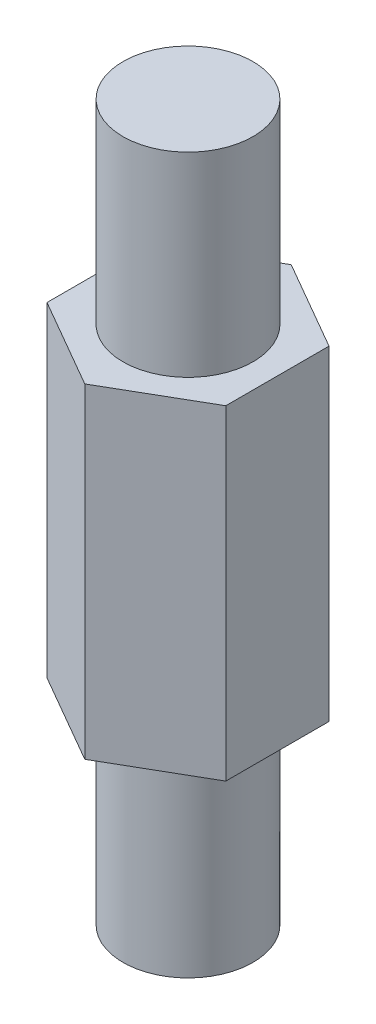
ISO-10303-21;
HEADER;
FILE_DESCRIPTION(('STEP AP214'),'2;1');
FILE_NAME('part.step','',(''),(''),'','','');
FILE_SCHEMA(('AUTOMOTIVE_DESIGN { 1 0 10303 214 1 1 1 1 }'));
ENDSEC;
DATA;
#1=APPLICATION_CONTEXT('core data for automotive mechanical design processes');
#2=APPLICATION_PROTOCOL_DEFINITION('international standard','automotive_design',2000,#1);
#3=PRODUCT_CONTEXT('',#1,'mechanical');
#4=PRODUCT('Part','Part','',(#3));
#5=PRODUCT_RELATED_PRODUCT_CATEGORY('part','',(#4));
#6=PRODUCT_DEFINITION_FORMATION('','',#4);
#7=PRODUCT_DEFINITION_CONTEXT('part definition',#1,'design');
#8=PRODUCT_DEFINITION('design','',#6,#7);
#9=PRODUCT_DEFINITION_SHAPE('','',#8);
#10=(LENGTH_UNIT() NAMED_UNIT(*) SI_UNIT(.MILLI.,.METRE.));
#11=(NAMED_UNIT(*) PLANE_ANGLE_UNIT() SI_UNIT($,.RADIAN.));
#12=(NAMED_UNIT(*) SI_UNIT($,.STERADIAN.) SOLID_ANGLE_UNIT());
#13=UNCERTAINTY_MEASURE_WITH_UNIT(LENGTH_MEASURE(1.E-05),#10,'distance_accuracy_value','');
#14=(GEOMETRIC_REPRESENTATION_CONTEXT(3) GLOBAL_UNCERTAINTY_ASSIGNED_CONTEXT((#13)) GLOBAL_UNIT_ASSIGNED_CONTEXT((#10,
#11,#12)) REPRESENTATION_CONTEXT('',''));
#15=CARTESIAN_POINT('',(0.,0.,0.));
#16=DIRECTION('',(0.,0.,1.));
#17=DIRECTION('',(1.,0.,0.));
#18=AXIS2_PLACEMENT_3D('',#15,#16,#17);
#19=CARTESIAN_POINT('',(0.,16.,0.));
#20=DIRECTION('',(0.,-1.,0.));
#21=DIRECTION('',(0.,0.,-1.));
#22=AXIS2_PLACEMENT_3D('',#19,#20,#21);
#23=CYLINDRICAL_SURFACE('',#22,2.);
#24=CARTESIAN_POINT('',(0.,16.,0.));
#25=DIRECTION('',(0.,1.,0.));
#26=DIRECTION('',(0.,0.,1.));
#27=AXIS2_PLACEMENT_3D('',#24,#25,#26);
#28=CIRCLE('',#27,2.);
#29=CARTESIAN_POINT('',(0.,16.,2.));
#30=VERTEX_POINT('',#29);
#31=EDGE_CURVE('E11',#30,#30,#28,.T.);
#32=ORIENTED_EDGE('',*,*,#31,.F.);
#33=EDGE_LOOP('',(#32));
#34=FACE_BOUND('',#33,.T.);
#35=CARTESIAN_POINT('',(0.,10.,0.));
#36=DIRECTION('',(0.,1.,0.));
#37=DIRECTION('',(0.,0.,1.));
#38=AXIS2_PLACEMENT_3D('',#35,#36,#37);
#39=CIRCLE('',#38,2.);
#40=CARTESIAN_POINT('',(0.,10.,2.));
#41=VERTEX_POINT('',#40);
#42=EDGE_CURVE('E50',#41,#41,#39,.T.);
#43=ORIENTED_EDGE('',*,*,#42,.T.);
#44=EDGE_LOOP('',(#43));
#45=FACE_BOUND('',#44,.T.);
#46=ADVANCED_FACE('F47',(#34,#45),#23,.T.);
#47=CARTESIAN_POINT('',(0.,16.,0.));
#48=DIRECTION('',(0.,1.,0.));
#49=DIRECTION('',(0.,0.,1.));
#50=AXIS2_PLACEMENT_3D('',#47,#48,#49);
#51=PLANE('',#50);
#52=ORIENTED_EDGE('',*,*,#31,.T.);
#53=EDGE_LOOP('',(#52));
#54=FACE_BOUND('',#53,.T.);
#55=ADVANCED_FACE('F62',(#54),#51,.T.);
#56=CARTESIAN_POINT('',(0.,10.,0.));
#57=DIRECTION('',(0.,1.,0.));
#58=DIRECTION('',(0.,0.,1.));
#59=AXIS2_PLACEMENT_3D('',#56,#57,#58);
#60=PLANE('',#59);
#61=ORIENTED_EDGE('',*,*,#42,.F.);
#62=EDGE_LOOP('',(#61));
#63=FACE_BOUND('',#62,.T.);
#64=ADVANCED_FACE('F60',(#63),#60,.F.);
#65=CLOSED_SHELL('',(#46,#55,#64));
#66=MANIFOLD_SOLID_BREP('B2',#65);
#67=CARTESIAN_POINT('',(-2.74999999999998,10.,1.5877132402715));
#68=DIRECTION('',(0.499999999999995,0.,-0.866025403784442));
#69=DIRECTION('',(-0.866025403784442,0.,-0.499999999999995));
#70=AXIS2_PLACEMENT_3D('',#67,#68,#69);
#71=PLANE('',#70);
#72=DIRECTION('',(0.866025403784442,0.,0.499999999999995));
#73=VECTOR('',#72,1.);
#74=CARTESIAN_POINT('',(-2.74999999999998,0.,1.5877132402715));
#75=LINE('',#74,#73);
#76=CARTESIAN_POINT('',(-2.74999999999998,0.,1.5877132402715));
#77=VERTEX_POINT('',#76);
#78=CARTESIAN_POINT('',(0.,0.,3.17542648054294));
#79=VERTEX_POINT('',#78);
#80=EDGE_CURVE('E179',#77,#79,#75,.T.);
#81=ORIENTED_EDGE('',*,*,#80,.T.);
#82=DIRECTION('',(0.,-1.,0.));
#83=VECTOR('',#82,1.);
#84=CARTESIAN_POINT('',(0.,10.,3.17542648054294));
#85=LINE('',#84,#83);
#86=CARTESIAN_POINT('',(0.,10.,3.17542648054294));
#87=VERTEX_POINT('',#86);
#88=EDGE_CURVE('E91',#87,#79,#85,.T.);
#89=ORIENTED_EDGE('',*,*,#88,.F.);
#90=DIRECTION('',(0.866025403784442,0.,0.499999999999995));
#91=VECTOR('',#90,1.);
#92=CARTESIAN_POINT('',(-2.74999999999998,10.,1.5877132402715));
#93=LINE('',#92,#91);
#94=CARTESIAN_POINT('',(-2.74999999999998,10.,1.5877132402715));
#95=VERTEX_POINT('',#94);
#96=EDGE_CURVE('E196',#95,#87,#93,.T.);
#97=ORIENTED_EDGE('',*,*,#96,.F.);
#98=DIRECTION('',(0.,-1.,0.));
#99=VECTOR('',#98,1.);
#100=CARTESIAN_POINT('',(-2.74999999999998,10.,1.5877132402715));
#101=LINE('',#100,#99);
#102=EDGE_CURVE('E175',#95,#77,#101,.T.);
#103=ORIENTED_EDGE('',*,*,#102,.T.);
#104=EDGE_LOOP('',(#81,#89,#97,#103));
#105=FACE_BOUND('',#104,.T.);
#106=ADVANCED_FACE('F88',(#105),#71,.F.);
#107=CARTESIAN_POINT('',(0.,10.,3.17542648054294));
#108=DIRECTION('',(-0.500000000000001,0.,-0.866025403784438));
#109=DIRECTION('',(-0.866025403784438,0.,0.500000000000001));
#110=AXIS2_PLACEMENT_3D('',#107,#108,#109);
#111=PLANE('',#110);
#112=DIRECTION('',(0.866025403784438,0.,-0.500000000000001));
#113=VECTOR('',#112,1.);
#114=CARTESIAN_POINT('',(0.,0.,3.17542648054294));
#115=LINE('',#114,#113);
#116=CARTESIAN_POINT('',(2.75000000000001,0.,1.58771324027147));
#117=VERTEX_POINT('',#116);
#118=EDGE_CURVE('E183',#79,#117,#115,.T.);
#119=ORIENTED_EDGE('',*,*,#118,.T.);
#120=DIRECTION('',(0.,-1.,0.));
#121=VECTOR('',#120,1.);
#122=CARTESIAN_POINT('',(2.75000000000001,10.,1.58771324027147));
#123=LINE('',#122,#121);
#124=CARTESIAN_POINT('',(2.75000000000001,10.,1.58771324027147));
#125=VERTEX_POINT('',#124);
#126=EDGE_CURVE('E202',#125,#117,#123,.T.);
#127=ORIENTED_EDGE('',*,*,#126,.F.);
#128=DIRECTION('',(0.866025403784438,0.,-0.500000000000001));
#129=VECTOR('',#128,1.);
#130=CARTESIAN_POINT('',(0.,10.,3.17542648054294));
#131=LINE('',#130,#129);
#132=EDGE_CURVE('E144',#87,#125,#131,.T.);
#133=ORIENTED_EDGE('',*,*,#132,.F.);
#134=ORIENTED_EDGE('',*,*,#88,.T.);
#135=EDGE_LOOP('',(#119,#127,#133,#134));
#136=FACE_BOUND('',#135,.T.);
#137=ADVANCED_FACE('F209',(#136),#111,.F.);
#138=CARTESIAN_POINT('',(2.75000000000001,10.,1.58771324027147));
#139=DIRECTION('',(-1.,0.,0.));
#140=DIRECTION('',(0.,0.,1.));
#141=AXIS2_PLACEMENT_3D('',#138,#139,#140);
#142=PLANE('',#141);
#143=DIRECTION('',(0.,0.,-1.));
#144=VECTOR('',#143,1.);
#145=CARTESIAN_POINT('',(2.75000000000001,0.,1.58771324027147));
#146=LINE('',#145,#144);
#147=CARTESIAN_POINT('',(2.75,0.,-1.58771324027148));
#148=VERTEX_POINT('',#147);
#149=EDGE_CURVE('E187',#117,#148,#146,.T.);
#150=ORIENTED_EDGE('',*,*,#149,.T.);
#151=DIRECTION('',(0.,-1.,0.));
#152=VECTOR('',#151,1.);
#153=CARTESIAN_POINT('',(2.75,10.,-1.58771324027148));
#154=LINE('',#153,#152);
#155=CARTESIAN_POINT('',(2.75,10.,-1.58771324027148));
#156=VERTEX_POINT('',#155);
#157=EDGE_CURVE('E168',#156,#148,#154,.T.);
#158=ORIENTED_EDGE('',*,*,#157,.F.);
#159=DIRECTION('',(0.,0.,-1.));
#160=VECTOR('',#159,1.);
#161=CARTESIAN_POINT('',(2.75000000000001,10.,1.58771324027147));
#162=LINE('',#161,#160);
#163=EDGE_CURVE('E157',#125,#156,#162,.T.);
#164=ORIENTED_EDGE('',*,*,#163,.F.);
#165=ORIENTED_EDGE('',*,*,#126,.T.);
#166=EDGE_LOOP('',(#150,#158,#164,#165));
#167=FACE_BOUND('',#166,.T.);
#168=ADVANCED_FACE('F215',(#167),#142,.F.);
#169=CARTESIAN_POINT('',(2.75,10.,-1.58771324027148));
#170=DIRECTION('',(-0.499999999999995,0.,0.866025403784442));
#171=DIRECTION('',(0.866025403784442,0.,0.499999999999995));
#172=AXIS2_PLACEMENT_3D('',#169,#170,#171);
#173=PLANE('',#172);
#174=DIRECTION('',(-0.866025403784442,0.,-0.499999999999995));
#175=VECTOR('',#174,1.);
#176=CARTESIAN_POINT('',(2.75,0.,-1.58771324027148));
#177=LINE('',#176,#175);
#178=CARTESIAN_POINT('',(0.,0.,-3.17542648054294));
#179=VERTEX_POINT('',#178);
#180=EDGE_CURVE('E166',#148,#179,#177,.T.);
#181=ORIENTED_EDGE('',*,*,#180,.T.);
#182=DIRECTION('',(0.,-1.,0.));
#183=VECTOR('',#182,1.);
#184=CARTESIAN_POINT('',(0.,10.,-3.17542648054294));
#185=LINE('',#184,#183);
#186=CARTESIAN_POINT('',(0.,10.,-3.17542648054294));
#187=VERTEX_POINT('',#186);
#188=EDGE_CURVE('E163',#187,#179,#185,.T.);
#189=ORIENTED_EDGE('',*,*,#188,.F.);
#190=DIRECTION('',(-0.866025403784442,0.,-0.499999999999995));
#191=VECTOR('',#190,1.);
#192=CARTESIAN_POINT('',(2.75,10.,-1.58771324027148));
#193=LINE('',#192,#191);
#194=EDGE_CURVE('E151',#156,#187,#193,.T.);
#195=ORIENTED_EDGE('',*,*,#194,.F.);
#196=ORIENTED_EDGE('',*,*,#157,.T.);
#197=EDGE_LOOP('',(#181,#189,#195,#196));
#198=FACE_BOUND('',#197,.T.);
#199=ADVANCED_FACE('F164',(#198),#173,.F.);
#200=CARTESIAN_POINT('',(0.,10.,-3.17542648054294));
#201=DIRECTION('',(0.500000000000007,0.,0.866025403784435));
#202=DIRECTION('',(0.866025403784435,0.,-0.500000000000007));
#203=AXIS2_PLACEMENT_3D('',#200,#201,#202);
#204=PLANE('',#203);
#205=DIRECTION('',(-0.866025403784435,0.,0.500000000000007));
#206=VECTOR('',#205,1.);
#207=CARTESIAN_POINT('',(0.,0.,-3.17542648054294));
#208=LINE('',#207,#206);
#209=CARTESIAN_POINT('',(-2.75000000000002,0.,-1.58771324027145));
#210=VERTEX_POINT('',#209);
#211=EDGE_CURVE('E129',#179,#210,#208,.T.);
#212=ORIENTED_EDGE('',*,*,#211,.T.);
#213=DIRECTION('',(0.,-1.,0.));
#214=VECTOR('',#213,1.);
#215=CARTESIAN_POINT('',(-2.75000000000002,10.,-1.58771324027145));
#216=LINE('',#215,#214);
#217=CARTESIAN_POINT('',(-2.75000000000002,10.,-1.58771324027145));
#218=VERTEX_POINT('',#217);
#219=EDGE_CURVE('E169',#218,#210,#216,.T.);
#220=ORIENTED_EDGE('',*,*,#219,.F.);
#221=DIRECTION('',(-0.866025403784435,0.,0.500000000000007));
#222=VECTOR('',#221,1.);
#223=CARTESIAN_POINT('',(0.,10.,-3.17542648054294));
#224=LINE('',#223,#222);
#225=EDGE_CURVE('E155',#187,#218,#224,.T.);
#226=ORIENTED_EDGE('',*,*,#225,.F.);
#227=ORIENTED_EDGE('',*,*,#188,.T.);
#228=EDGE_LOOP('',(#212,#220,#226,#227));
#229=FACE_BOUND('',#228,.T.);
#230=ADVANCED_FACE('F171',(#229),#204,.F.);
#231=CARTESIAN_POINT('',(-2.75000000000002,10.,-1.58771324027145));
#232=DIRECTION('',(1.,0.,0.));
#233=DIRECTION('',(0.,0.,-1.));
#234=AXIS2_PLACEMENT_3D('',#231,#232,#233);
#235=PLANE('',#234);
#236=DIRECTION('',(0.,0.,1.));
#237=VECTOR('',#236,1.);
#238=CARTESIAN_POINT('',(-2.75000000000002,0.,-1.58771324027145));
#239=LINE('',#238,#237);
#240=EDGE_CURVE('E135',#210,#77,#239,.T.);
#241=ORIENTED_EDGE('',*,*,#240,.T.);
#242=ORIENTED_EDGE('',*,*,#102,.F.);
#243=DIRECTION('',(0.,0.,1.));
#244=VECTOR('',#243,1.);
#245=CARTESIAN_POINT('',(-2.75000000000002,10.,-1.58771324027145));
#246=LINE('',#245,#244);
#247=EDGE_CURVE('E106',#218,#95,#246,.T.);
#248=ORIENTED_EDGE('',*,*,#247,.F.);
#249=ORIENTED_EDGE('',*,*,#219,.T.);
#250=EDGE_LOOP('',(#241,#242,#248,#249));
#251=FACE_BOUND('',#250,.T.);
#252=ADVANCED_FACE('F239',(#251),#235,.F.);
#253=CARTESIAN_POINT('',(0.,10.,0.));
#254=DIRECTION('',(0.,1.,0.));
#255=DIRECTION('',(0.,0.,1.));
#256=AXIS2_PLACEMENT_3D('',#253,#254,#255);
#257=PLANE('',#256);
#258=ORIENTED_EDGE('',*,*,#96,.T.);
#259=ORIENTED_EDGE('',*,*,#132,.T.);
#260=ORIENTED_EDGE('',*,*,#163,.T.);
#261=ORIENTED_EDGE('',*,*,#194,.T.);
#262=ORIENTED_EDGE('',*,*,#225,.T.);
#263=ORIENTED_EDGE('',*,*,#247,.T.);
#264=EDGE_LOOP('',(#258,#259,#260,#261,#262,#263));
#265=FACE_BOUND('',#264,.T.);
#266=ADVANCED_FACE('F153',(#265),#257,.T.);
#267=CARTESIAN_POINT('',(0.,0.,0.));
#268=DIRECTION('',(0.,1.,0.));
#269=DIRECTION('',(0.,0.,1.));
#270=AXIS2_PLACEMENT_3D('',#267,#268,#269);
#271=PLANE('',#270);
#272=CARTESIAN_POINT('',(0.,0.,0.));
#273=DIRECTION('',(0.,-1.,0.));
#274=DIRECTION('',(0.,0.,-1.));
#275=AXIS2_PLACEMENT_3D('',#272,#273,#274);
#276=CIRCLE('',#275,2.);
#277=CARTESIAN_POINT('',(0.,0.,-2.));
#278=VERTEX_POINT('',#277);
#279=EDGE_CURVE('E45',#278,#278,#276,.T.);
#280=ORIENTED_EDGE('',*,*,#279,.F.);
#281=EDGE_LOOP('',(#280));
#282=FACE_BOUND('',#281,.T.);
#283=ORIENTED_EDGE('',*,*,#80,.F.);
#284=ORIENTED_EDGE('',*,*,#240,.F.);
#285=ORIENTED_EDGE('',*,*,#211,.F.);
#286=ORIENTED_EDGE('',*,*,#180,.F.);
#287=ORIENTED_EDGE('',*,*,#149,.F.);
#288=ORIENTED_EDGE('',*,*,#118,.F.);
#289=EDGE_LOOP('',(#283,#284,#285,#286,#287,#288));
#290=FACE_BOUND('',#289,.T.);
#291=ADVANCED_FACE('F214',(#282,#290),#271,.F.);
#292=CARTESIAN_POINT('',(0.,-6.,0.));
#293=DIRECTION('',(0.,1.,0.));
#294=DIRECTION('',(0.,0.,1.));
#295=AXIS2_PLACEMENT_3D('',#292,#293,#294);
#296=CYLINDRICAL_SURFACE('',#295,2.);
#297=CARTESIAN_POINT('',(0.,-6.,0.));
#298=DIRECTION('',(0.,-1.,0.));
#299=DIRECTION('',(0.,0.,-1.));
#300=AXIS2_PLACEMENT_3D('',#297,#298,#299);
#301=CIRCLE('',#300,2.);
#302=CARTESIAN_POINT('',(0.,-6.,-2.));
#303=VERTEX_POINT('',#302);
#304=EDGE_CURVE('E184',#303,#303,#301,.T.);
#305=ORIENTED_EDGE('',*,*,#304,.F.);
#306=EDGE_LOOP('',(#305));
#307=FACE_BOUND('',#306,.T.);
#308=ORIENTED_EDGE('',*,*,#279,.T.);
#309=EDGE_LOOP('',(#308));
#310=FACE_BOUND('',#309,.T.);
#311=ADVANCED_FACE('F228',(#307,#310),#296,.T.);
#312=CARTESIAN_POINT('',(0.,-6.,0.));
#313=DIRECTION('',(0.,-1.,0.));
#314=DIRECTION('',(0.,0.,-1.));
#315=AXIS2_PLACEMENT_3D('',#312,#313,#314);
#316=PLANE('',#315);
#317=ORIENTED_EDGE('',*,*,#304,.T.);
#318=EDGE_LOOP('',(#317));
#319=FACE_BOUND('',#318,.T.);
#320=ADVANCED_FACE('F226',(#319),#316,.T.);
#321=CLOSED_SHELL('',(#106,#137,#168,#199,#230,#252,#266,#291,#311,#320));
#322=MANIFOLD_SOLID_BREP('B6',#321);
#323=ADVANCED_BREP_SHAPE_REPRESENTATION('',(#18,#66,#322),#14);
#324=SHAPE_DEFINITION_REPRESENTATION(#9,#323);
ENDSEC;
END-ISO-10303-21;
